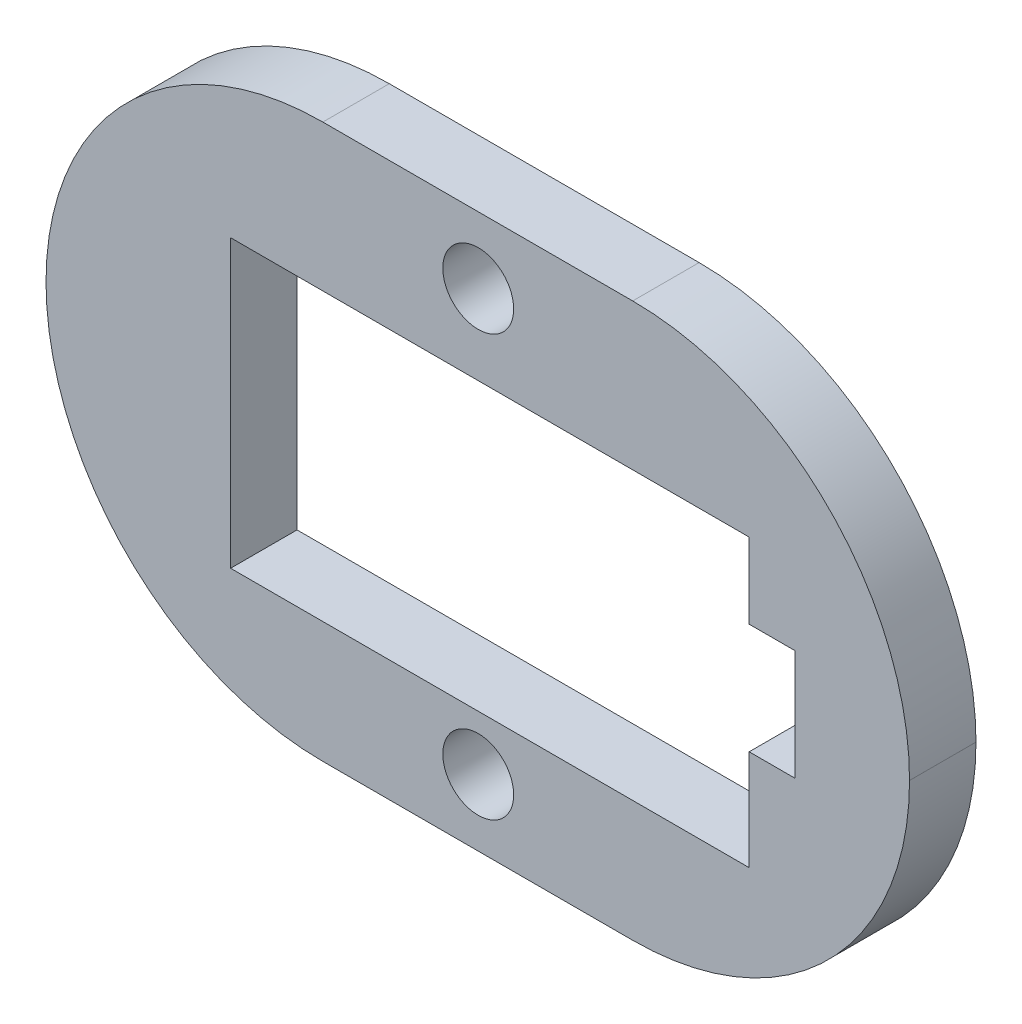
ISO-10303-21;
HEADER;
FILE_DESCRIPTION(('STEP AP214'),'2;1');
FILE_NAME('part.step','',(''),(''),'','','');
FILE_SCHEMA(('AUTOMOTIVE_DESIGN { 1 0 10303 214 1 1 1 1 }'));
ENDSEC;
DATA;
#1=APPLICATION_CONTEXT('core data for automotive mechanical design processes');
#2=APPLICATION_PROTOCOL_DEFINITION('international standard','automotive_design',2000,#1);
#3=PRODUCT_CONTEXT('',#1,'mechanical');
#4=PRODUCT('Part','Part','',(#3));
#5=PRODUCT_RELATED_PRODUCT_CATEGORY('part','',(#4));
#6=PRODUCT_DEFINITION_FORMATION('','',#4);
#7=PRODUCT_DEFINITION_CONTEXT('part definition',#1,'design');
#8=PRODUCT_DEFINITION('design','',#6,#7);
#9=PRODUCT_DEFINITION_SHAPE('','',#8);
#10=(LENGTH_UNIT() NAMED_UNIT(*) SI_UNIT(.MILLI.,.METRE.));
#11=(NAMED_UNIT(*) PLANE_ANGLE_UNIT() SI_UNIT($,.RADIAN.));
#12=(NAMED_UNIT(*) SI_UNIT($,.STERADIAN.) SOLID_ANGLE_UNIT());
#13=UNCERTAINTY_MEASURE_WITH_UNIT(LENGTH_MEASURE(1.E-05),#10,'distance_accuracy_value','');
#14=(GEOMETRIC_REPRESENTATION_CONTEXT(3) GLOBAL_UNCERTAINTY_ASSIGNED_CONTEXT((#13)) GLOBAL_UNIT_ASSIGNED_CONTEXT((#10,
#11,#12)) REPRESENTATION_CONTEXT('',''));
#15=CARTESIAN_POINT('',(0.,0.,0.));
#16=DIRECTION('',(0.,0.,1.));
#17=DIRECTION('',(1.,0.,0.));
#18=AXIS2_PLACEMENT_3D('',#15,#16,#17);
#19=CARTESIAN_POINT('',(-8.50332149258777,12.5,3.));
#20=DIRECTION('',(0.,0.,-1.));
#21=DIRECTION('',(-1.,0.,0.));
#22=AXIS2_PLACEMENT_3D('',#19,#20,#21);
#23=CYLINDRICAL_SURFACE('',#22,12.5);
#24=CARTESIAN_POINT('',(-8.50332149258777,12.5,0.));
#25=DIRECTION('',(0.,0.,-1.));
#26=DIRECTION('',(-1.,0.,0.));
#27=AXIS2_PLACEMENT_3D('',#24,#25,#26);
#28=CIRCLE('',#27,12.5);
#29=CARTESIAN_POINT('',(-8.50332149258777,0.,0.));
#30=VERTEX_POINT('',#29);
#31=CARTESIAN_POINT('',(-21.0033214925878,12.5,0.));
#32=VERTEX_POINT('',#31);
#33=EDGE_CURVE('E210',#30,#32,#28,.T.);
#34=ORIENTED_EDGE('',*,*,#33,.F.);
#35=DIRECTION('',(0.,0.,-1.));
#36=VECTOR('',#35,1.);
#37=CARTESIAN_POINT('',(-8.50332149258777,0.,3.));
#38=LINE('',#37,#36);
#39=CARTESIAN_POINT('',(-8.50332149258777,0.,3.));
#40=VERTEX_POINT('',#39);
#41=EDGE_CURVE('E264',#40,#30,#38,.T.);
#42=ORIENTED_EDGE('',*,*,#41,.F.);
#43=CARTESIAN_POINT('',(-8.50332149258777,12.5,3.));
#44=DIRECTION('',(0.,0.,-1.));
#45=DIRECTION('',(-1.,0.,0.));
#46=AXIS2_PLACEMENT_3D('',#43,#44,#45);
#47=CIRCLE('',#46,12.5);
#48=CARTESIAN_POINT('',(-21.0033214925878,12.5,3.));
#49=VERTEX_POINT('',#48);
#50=EDGE_CURVE('E222',#40,#49,#47,.T.);
#51=ORIENTED_EDGE('',*,*,#50,.T.);
#52=DIRECTION('',(0.,0.,-1.));
#53=VECTOR('',#52,1.);
#54=CARTESIAN_POINT('',(-21.0033214925878,12.5,3.));
#55=LINE('',#54,#53);
#56=EDGE_CURVE('E244',#49,#32,#55,.T.);
#57=ORIENTED_EDGE('',*,*,#56,.T.);
#58=EDGE_LOOP('',(#34,#42,#51,#57));
#59=FACE_BOUND('',#58,.T.);
#60=ADVANCED_FACE('F41',(#59),#23,.T.);
#61=CARTESIAN_POINT('',(5.48658919269266,0.,3.));
#62=DIRECTION('',(0.,-1.,0.));
#63=DIRECTION('',(0.,0.,-1.));
#64=AXIS2_PLACEMENT_3D('',#61,#62,#63);
#65=PLANE('',#64);
#66=DIRECTION('',(-1.,0.,0.));
#67=VECTOR('',#66,1.);
#68=CARTESIAN_POINT('',(5.48658919269266,0.,0.));
#69=LINE('',#68,#67);
#70=CARTESIAN_POINT('',(5.48658919269266,0.,0.));
#71=VERTEX_POINT('',#70);
#72=EDGE_CURVE('E226',#71,#30,#69,.T.);
#73=ORIENTED_EDGE('',*,*,#72,.F.);
#74=DIRECTION('',(0.,0.,-1.));
#75=VECTOR('',#74,1.);
#76=CARTESIAN_POINT('',(5.48658919269266,0.,3.));
#77=LINE('',#76,#75);
#78=CARTESIAN_POINT('',(5.48658919269266,0.,3.));
#79=VERTEX_POINT('',#78);
#80=EDGE_CURVE('E267',#79,#71,#77,.T.);
#81=ORIENTED_EDGE('',*,*,#80,.F.);
#82=DIRECTION('',(-1.,0.,0.));
#83=VECTOR('',#82,1.);
#84=CARTESIAN_POINT('',(5.48658919269266,0.,3.));
#85=LINE('',#84,#83);
#86=EDGE_CURVE('E241',#79,#40,#85,.T.);
#87=ORIENTED_EDGE('',*,*,#86,.T.);
#88=ORIENTED_EDGE('',*,*,#41,.T.);
#89=EDGE_LOOP('',(#73,#81,#87,#88));
#90=FACE_BOUND('',#89,.T.);
#91=ADVANCED_FACE('F327',(#90),#65,.T.);
#92=CARTESIAN_POINT('',(5.48658919269266,12.5,3.));
#93=DIRECTION('',(0.,0.,-1.));
#94=DIRECTION('',(-1.,0.,0.));
#95=AXIS2_PLACEMENT_3D('',#92,#93,#94);
#96=CYLINDRICAL_SURFACE('',#95,12.5);
#97=CARTESIAN_POINT('',(5.48658919269266,12.5,0.));
#98=DIRECTION('',(0.,0.,-1.));
#99=DIRECTION('',(-1.,0.,0.));
#100=AXIS2_PLACEMENT_3D('',#97,#98,#99);
#101=CIRCLE('',#100,12.5);
#102=CARTESIAN_POINT('',(17.9865891926927,12.5,0.));
#103=VERTEX_POINT('',#102);
#104=EDGE_CURVE('E259',#103,#71,#101,.T.);
#105=ORIENTED_EDGE('',*,*,#104,.F.);
#106=DIRECTION('',(0.,0.,-1.));
#107=VECTOR('',#106,1.);
#108=CARTESIAN_POINT('',(17.9865891926927,12.5,3.));
#109=LINE('',#108,#107);
#110=CARTESIAN_POINT('',(17.9865891926927,12.5,3.));
#111=VERTEX_POINT('',#110);
#112=EDGE_CURVE('E269',#111,#103,#109,.T.);
#113=ORIENTED_EDGE('',*,*,#112,.F.);
#114=CARTESIAN_POINT('',(5.48658919269266,12.5,3.));
#115=DIRECTION('',(0.,0.,-1.));
#116=DIRECTION('',(-1.,0.,0.));
#117=AXIS2_PLACEMENT_3D('',#114,#115,#116);
#118=CIRCLE('',#117,12.5);
#119=EDGE_CURVE('E238',#111,#79,#118,.T.);
#120=ORIENTED_EDGE('',*,*,#119,.T.);
#121=ORIENTED_EDGE('',*,*,#80,.T.);
#122=EDGE_LOOP('',(#105,#113,#120,#121));
#123=FACE_BOUND('',#122,.T.);
#124=ADVANCED_FACE('F325',(#123),#96,.T.);
#125=CARTESIAN_POINT('',(17.9865891926927,12.501,3.));
#126=DIRECTION('',(1.,0.,0.));
#127=DIRECTION('',(0.,0.,-1.));
#128=AXIS2_PLACEMENT_3D('',#125,#126,#127);
#129=PLANE('',#128);
#130=DIRECTION('',(0.,-1.,0.));
#131=VECTOR('',#130,1.);
#132=CARTESIAN_POINT('',(17.9865891926927,12.501,0.));
#133=LINE('',#132,#131);
#134=CARTESIAN_POINT('',(17.9865891926927,12.501,0.));
#135=VERTEX_POINT('',#134);
#136=EDGE_CURVE('E256',#135,#103,#133,.T.);
#137=ORIENTED_EDGE('',*,*,#136,.F.);
#138=DIRECTION('',(0.,0.,-1.));
#139=VECTOR('',#138,1.);
#140=CARTESIAN_POINT('',(17.9865891926927,12.501,3.));
#141=LINE('',#140,#139);
#142=CARTESIAN_POINT('',(17.9865891926927,12.501,3.));
#143=VERTEX_POINT('',#142);
#144=EDGE_CURVE('E271',#143,#135,#141,.T.);
#145=ORIENTED_EDGE('',*,*,#144,.F.);
#146=DIRECTION('',(0.,-1.,0.));
#147=VECTOR('',#146,1.);
#148=CARTESIAN_POINT('',(17.9865891926927,12.501,3.));
#149=LINE('',#148,#147);
#150=EDGE_CURVE('E235',#143,#111,#149,.T.);
#151=ORIENTED_EDGE('',*,*,#150,.T.);
#152=ORIENTED_EDGE('',*,*,#112,.T.);
#153=EDGE_LOOP('',(#137,#145,#151,#152));
#154=FACE_BOUND('',#153,.T.);
#155=ADVANCED_FACE('F321',(#154),#129,.T.);
#156=CARTESIAN_POINT('',(5.48658919269266,12.501,3.));
#157=DIRECTION('',(0.,0.,-1.));
#158=DIRECTION('',(-1.,0.,0.));
#159=AXIS2_PLACEMENT_3D('',#156,#157,#158);
#160=CYLINDRICAL_SURFACE('',#159,12.5);
#161=CARTESIAN_POINT('',(5.48658919269266,12.501,0.));
#162=DIRECTION('',(0.,0.,-1.));
#163=DIRECTION('',(-1.,0.,0.));
#164=AXIS2_PLACEMENT_3D('',#161,#162,#163);
#165=CIRCLE('',#164,12.5);
#166=CARTESIAN_POINT('',(5.48658919269266,25.001,0.));
#167=VERTEX_POINT('',#166);
#168=EDGE_CURVE('E253',#167,#135,#165,.T.);
#169=ORIENTED_EDGE('',*,*,#168,.F.);
#170=DIRECTION('',(0.,0.,-1.));
#171=VECTOR('',#170,1.);
#172=CARTESIAN_POINT('',(5.48658919269266,25.001,3.));
#173=LINE('',#172,#171);
#174=CARTESIAN_POINT('',(5.48658919269266,25.001,3.));
#175=VERTEX_POINT('',#174);
#176=EDGE_CURVE('E273',#175,#167,#173,.T.);
#177=ORIENTED_EDGE('',*,*,#176,.F.);
#178=CARTESIAN_POINT('',(5.48658919269266,12.501,3.));
#179=DIRECTION('',(0.,0.,-1.));
#180=DIRECTION('',(-1.,0.,0.));
#181=AXIS2_PLACEMENT_3D('',#178,#179,#180);
#182=CIRCLE('',#181,12.5);
#183=EDGE_CURVE('E232',#175,#143,#182,.T.);
#184=ORIENTED_EDGE('',*,*,#183,.T.);
#185=ORIENTED_EDGE('',*,*,#144,.T.);
#186=EDGE_LOOP('',(#169,#177,#184,#185));
#187=FACE_BOUND('',#186,.T.);
#188=ADVANCED_FACE('F317',(#187),#160,.T.);
#189=CARTESIAN_POINT('',(-8.50332151258617,25.001,3.));
#190=DIRECTION('',(0.,1.,0.));
#191=DIRECTION('',(-1.,0.,0.));
#192=AXIS2_PLACEMENT_3D('',#189,#190,#191);
#193=PLANE('',#192);
#194=DIRECTION('',(1.,0.,0.));
#195=VECTOR('',#194,1.);
#196=CARTESIAN_POINT('',(-8.50332151258617,25.001,0.));
#197=LINE('',#196,#195);
#198=CARTESIAN_POINT('',(-8.50332151258617,25.001,0.));
#199=VERTEX_POINT('',#198);
#200=EDGE_CURVE('E250',#199,#167,#197,.T.);
#201=ORIENTED_EDGE('',*,*,#200,.F.);
#202=DIRECTION('',(0.,0.,-1.));
#203=VECTOR('',#202,1.);
#204=CARTESIAN_POINT('',(-8.50332151258617,25.001,3.));
#205=LINE('',#204,#203);
#206=CARTESIAN_POINT('',(-8.50332151258617,25.001,3.));
#207=VERTEX_POINT('',#206);
#208=EDGE_CURVE('E275',#207,#199,#205,.T.);
#209=ORIENTED_EDGE('',*,*,#208,.F.);
#210=DIRECTION('',(1.,0.,0.));
#211=VECTOR('',#210,1.);
#212=CARTESIAN_POINT('',(-8.50332151258617,25.001,3.));
#213=LINE('',#212,#211);
#214=EDGE_CURVE('E229',#207,#175,#213,.T.);
#215=ORIENTED_EDGE('',*,*,#214,.T.);
#216=ORIENTED_EDGE('',*,*,#176,.T.);
#217=EDGE_LOOP('',(#201,#209,#215,#216));
#218=FACE_BOUND('',#217,.T.);
#219=ADVANCED_FACE('F313',(#218),#193,.T.);
#220=CARTESIAN_POINT('',(-8.50332151258617,12.50099998,3.));
#221=DIRECTION('',(0.,0.,-1.));
#222=DIRECTION('',(-1.,0.,0.));
#223=AXIS2_PLACEMENT_3D('',#220,#221,#222);
#224=CYLINDRICAL_SURFACE('',#223,12.50000002);
#225=CARTESIAN_POINT('',(-8.50332151258617,12.50099998,0.));
#226=DIRECTION('',(0.,0.,-1.));
#227=DIRECTION('',(-1.,0.,0.));
#228=AXIS2_PLACEMENT_3D('',#225,#226,#227);
#229=CIRCLE('',#228,12.50000002);
#230=EDGE_CURVE('E247',#32,#199,#229,.T.);
#231=ORIENTED_EDGE('',*,*,#230,.F.);
#232=ORIENTED_EDGE('',*,*,#56,.F.);
#233=CARTESIAN_POINT('',(-8.50332151258617,12.50099998,3.));
#234=DIRECTION('',(0.,0.,-1.));
#235=DIRECTION('',(-1.,0.,0.));
#236=AXIS2_PLACEMENT_3D('',#233,#234,#235);
#237=CIRCLE('',#236,12.50000002);
#238=EDGE_CURVE('E225',#49,#207,#237,.T.);
#239=ORIENTED_EDGE('',*,*,#238,.T.);
#240=ORIENTED_EDGE('',*,*,#208,.T.);
#241=EDGE_LOOP('',(#231,#232,#239,#240));
#242=FACE_BOUND('',#241,.T.);
#243=ADVANCED_FACE('F309',(#242),#224,.T.);
#244=CARTESIAN_POINT('',(-8.50332149258777,12.5,3.));
#245=DIRECTION('',(0.,0.,-1.));
#246=DIRECTION('',(-1.,0.,0.));
#247=AXIS2_PLACEMENT_3D('',#244,#245,#246);
#248=PLANE('',#247);
#249=CARTESIAN_POINT('',(-1.48790597129112,21.9995,3.));
#250=DIRECTION('',(0.,0.,1.));
#251=DIRECTION('',(1.,0.,0.));
#252=AXIS2_PLACEMENT_3D('',#249,#250,#251);
#253=CIRCLE('',#252,1.6);
#254=CARTESIAN_POINT('',(0.11209402870888,21.9995,3.));
#255=VERTEX_POINT('',#254);
#256=EDGE_CURVE('E192',#255,#255,#253,.T.);
#257=ORIENTED_EDGE('',*,*,#256,.F.);
#258=EDGE_LOOP('',(#257));
#259=FACE_BOUND('',#258,.T.);
#260=CARTESIAN_POINT('',(-1.48790597129112,2.9995,3.));
#261=DIRECTION('',(0.,0.,1.));
#262=DIRECTION('',(1.,0.,0.));
#263=AXIS2_PLACEMENT_3D('',#260,#261,#262);
#264=CIRCLE('',#263,1.6);
#265=CARTESIAN_POINT('',(0.11209402870888,2.9995,3.));
#266=VERTEX_POINT('',#265);
#267=EDGE_CURVE('E174',#266,#266,#264,.T.);
#268=ORIENTED_EDGE('',*,*,#267,.F.);
#269=EDGE_LOOP('',(#268));
#270=FACE_BOUND('',#269,.T.);
#271=DIRECTION('',(1.,0.,0.));
#272=VECTOR('',#271,1.);
#273=CARTESIAN_POINT('',(12.8054141089037,14.9896847646827,3.));
#274=LINE('',#273,#272);
#275=CARTESIAN_POINT('',(10.7445904090118,14.9896847646827,3.));
#276=VERTEX_POINT('',#275);
#277=CARTESIAN_POINT('',(12.8054141089037,14.9896847646827,3.));
#278=VERTEX_POINT('',#277);
#279=EDGE_CURVE('E157',#276,#278,#274,.T.);
#280=ORIENTED_EDGE('',*,*,#279,.T.);
#281=DIRECTION('',(0.,-1.,0.));
#282=VECTOR('',#281,1.);
#283=CARTESIAN_POINT('',(12.8054141089037,10.001,3.));
#284=LINE('',#283,#282);
#285=CARTESIAN_POINT('',(12.8054141089037,10.001,3.));
#286=VERTEX_POINT('',#285);
#287=EDGE_CURVE('E151',#278,#286,#284,.T.);
#288=ORIENTED_EDGE('',*,*,#287,.T.);
#289=DIRECTION('',(-1.,0.,0.));
#290=VECTOR('',#289,1.);
#291=CARTESIAN_POINT('',(10.7445904090118,10.001,3.));
#292=LINE('',#291,#290);
#293=CARTESIAN_POINT('',(10.7445904090118,10.001,3.));
#294=VERTEX_POINT('',#293);
#295=EDGE_CURVE('E160',#286,#294,#292,.T.);
#296=ORIENTED_EDGE('',*,*,#295,.T.);
#297=DIRECTION('',(0.,-1.,0.));
#298=VECTOR('',#297,1.);
#299=CARTESIAN_POINT('',(10.7445904090118,5.47023212857004,3.));
#300=LINE('',#299,#298);
#301=CARTESIAN_POINT('',(10.7445904090118,5.47023212857004,3.));
#302=VERTEX_POINT('',#301);
#303=EDGE_CURVE('E57',#294,#302,#300,.T.);
#304=ORIENTED_EDGE('',*,*,#303,.T.);
#305=DIRECTION('',(-1.,0.,0.));
#306=VECTOR('',#305,1.);
#307=CARTESIAN_POINT('',(-12.6687342064032,5.47023212857004,3.));
#308=LINE('',#307,#306);
#309=CARTESIAN_POINT('',(-12.6687342064032,5.47023212857004,3.));
#310=VERTEX_POINT('',#309);
#311=EDGE_CURVE('E178',#302,#310,#308,.T.);
#312=ORIENTED_EDGE('',*,*,#311,.T.);
#313=DIRECTION('',(0.,1.,0.));
#314=VECTOR('',#313,1.);
#315=CARTESIAN_POINT('',(-12.6687342064032,18.3961064057703,3.));
#316=LINE('',#315,#314);
#317=CARTESIAN_POINT('',(-12.6687342064032,18.3961064057703,3.));
#318=VERTEX_POINT('',#317);
#319=EDGE_CURVE('E181',#310,#318,#316,.T.);
#320=ORIENTED_EDGE('',*,*,#319,.T.);
#321=DIRECTION('',(1.,0.,0.));
#322=VECTOR('',#321,1.);
#323=CARTESIAN_POINT('',(10.7445904090118,18.3961064057703,3.));
#324=LINE('',#323,#322);
#325=CARTESIAN_POINT('',(10.7445904090118,18.3961064057703,3.));
#326=VERTEX_POINT('',#325);
#327=EDGE_CURVE('E184',#318,#326,#324,.T.);
#328=ORIENTED_EDGE('',*,*,#327,.T.);
#329=DIRECTION('',(0.,-1.,0.));
#330=VECTOR('',#329,1.);
#331=CARTESIAN_POINT('',(10.7445904090118,14.9896847646827,3.));
#332=LINE('',#331,#330);
#333=EDGE_CURVE('E187',#326,#276,#332,.T.);
#334=ORIENTED_EDGE('',*,*,#333,.T.);
#335=EDGE_LOOP('',(#280,#288,#296,#304,#312,#320,#328,#334));
#336=FACE_BOUND('',#335,.T.);
#337=ORIENTED_EDGE('',*,*,#50,.F.);
#338=ORIENTED_EDGE('',*,*,#86,.F.);
#339=ORIENTED_EDGE('',*,*,#119,.F.);
#340=ORIENTED_EDGE('',*,*,#150,.F.);
#341=ORIENTED_EDGE('',*,*,#183,.F.);
#342=ORIENTED_EDGE('',*,*,#214,.F.);
#343=ORIENTED_EDGE('',*,*,#238,.F.);
#344=EDGE_LOOP('',(#337,#338,#339,#340,#341,#342,#343));
#345=FACE_BOUND('',#344,.T.);
#346=ADVANCED_FACE('F164',(#259,#270,#336,#345),#248,.F.);
#347=CARTESIAN_POINT('',(-8.50332149258777,12.5,0.));
#348=DIRECTION('',(0.,0.,-1.));
#349=DIRECTION('',(-1.,0.,0.));
#350=AXIS2_PLACEMENT_3D('',#347,#348,#349);
#351=PLANE('',#350);
#352=CARTESIAN_POINT('',(-1.48790597129112,2.9995,0.));
#353=DIRECTION('',(0.,0.,-1.));
#354=DIRECTION('',(-1.,0.,0.));
#355=AXIS2_PLACEMENT_3D('',#352,#353,#354);
#356=CIRCLE('',#355,1.9);
#357=CARTESIAN_POINT('',(-3.38790597129112,2.9995,0.));
#358=VERTEX_POINT('',#357);
#359=EDGE_CURVE('E280',#358,#358,#356,.F.);
#360=ORIENTED_EDGE('',*,*,#359,.T.);
#361=EDGE_LOOP('',(#360));
#362=FACE_BOUND('',#361,.T.);
#363=CARTESIAN_POINT('',(-1.48790597129112,21.9995,0.));
#364=DIRECTION('',(0.,0.,-1.));
#365=DIRECTION('',(-1.,0.,0.));
#366=AXIS2_PLACEMENT_3D('',#363,#364,#365);
#367=CIRCLE('',#366,1.9);
#368=CARTESIAN_POINT('',(-3.38790597129112,21.9995,0.));
#369=VERTEX_POINT('',#368);
#370=EDGE_CURVE('E266',#369,#369,#367,.F.);
#371=ORIENTED_EDGE('',*,*,#370,.T.);
#372=EDGE_LOOP('',(#371));
#373=FACE_BOUND('',#372,.T.);
#374=DIRECTION('',(0.,-1.,0.));
#375=VECTOR('',#374,1.);
#376=CARTESIAN_POINT('',(12.8054141089037,10.001,0.));
#377=LINE('',#376,#375);
#378=CARTESIAN_POINT('',(12.8054141089037,14.9896847646827,0.));
#379=VERTEX_POINT('',#378);
#380=CARTESIAN_POINT('',(12.8054141089037,10.001,0.));
#381=VERTEX_POINT('',#380);
#382=EDGE_CURVE('E65',#379,#381,#377,.T.);
#383=ORIENTED_EDGE('',*,*,#382,.F.);
#384=DIRECTION('',(1.,0.,0.));
#385=VECTOR('',#384,1.);
#386=CARTESIAN_POINT('',(12.8054141089037,14.9896847646827,0.));
#387=LINE('',#386,#385);
#388=CARTESIAN_POINT('',(10.7445904090118,14.9896847646827,0.));
#389=VERTEX_POINT('',#388);
#390=EDGE_CURVE('E168',#389,#379,#387,.T.);
#391=ORIENTED_EDGE('',*,*,#390,.F.);
#392=DIRECTION('',(0.,-1.,0.));
#393=VECTOR('',#392,1.);
#394=CARTESIAN_POINT('',(10.7445904090118,14.9896847646827,0.));
#395=LINE('',#394,#393);
#396=CARTESIAN_POINT('',(10.7445904090118,18.3961064057703,0.));
#397=VERTEX_POINT('',#396);
#398=EDGE_CURVE('E171',#397,#389,#395,.T.);
#399=ORIENTED_EDGE('',*,*,#398,.F.);
#400=DIRECTION('',(1.,0.,0.));
#401=VECTOR('',#400,1.);
#402=CARTESIAN_POINT('',(10.7445904090118,18.3961064057703,0.));
#403=LINE('',#402,#401);
#404=CARTESIAN_POINT('',(-12.6687342064032,18.3961064057703,0.));
#405=VERTEX_POINT('',#404);
#406=EDGE_CURVE('E203',#405,#397,#403,.T.);
#407=ORIENTED_EDGE('',*,*,#406,.F.);
#408=DIRECTION('',(0.,1.,0.));
#409=VECTOR('',#408,1.);
#410=CARTESIAN_POINT('',(-12.6687342064032,18.3961064057703,0.));
#411=LINE('',#410,#409);
#412=CARTESIAN_POINT('',(-12.6687342064032,5.47023212857004,0.));
#413=VERTEX_POINT('',#412);
#414=EDGE_CURVE('E200',#413,#405,#411,.T.);
#415=ORIENTED_EDGE('',*,*,#414,.F.);
#416=DIRECTION('',(-1.,0.,0.));
#417=VECTOR('',#416,1.);
#418=CARTESIAN_POINT('',(-12.6687342064032,5.47023212857004,0.));
#419=LINE('',#418,#417);
#420=CARTESIAN_POINT('',(10.7445904090118,5.47023212857004,0.));
#421=VERTEX_POINT('',#420);
#422=EDGE_CURVE('E197',#421,#413,#419,.T.);
#423=ORIENTED_EDGE('',*,*,#422,.F.);
#424=DIRECTION('',(0.,-1.,0.));
#425=VECTOR('',#424,1.);
#426=CARTESIAN_POINT('',(10.7445904090118,5.47023212857004,0.));
#427=LINE('',#426,#425);
#428=CARTESIAN_POINT('',(10.7445904090118,10.001,0.));
#429=VERTEX_POINT('',#428);
#430=EDGE_CURVE('E194',#429,#421,#427,.T.);
#431=ORIENTED_EDGE('',*,*,#430,.F.);
#432=DIRECTION('',(-1.,0.,0.));
#433=VECTOR('',#432,1.);
#434=CARTESIAN_POINT('',(10.7445904090118,10.001,0.));
#435=LINE('',#434,#433);
#436=EDGE_CURVE('E191',#381,#429,#435,.T.);
#437=ORIENTED_EDGE('',*,*,#436,.F.);
#438=EDGE_LOOP('',(#383,#391,#399,#407,#415,#423,#431,#437));
#439=FACE_BOUND('',#438,.T.);
#440=ORIENTED_EDGE('',*,*,#33,.T.);
#441=ORIENTED_EDGE('',*,*,#230,.T.);
#442=ORIENTED_EDGE('',*,*,#200,.T.);
#443=ORIENTED_EDGE('',*,*,#168,.T.);
#444=ORIENTED_EDGE('',*,*,#136,.T.);
#445=ORIENTED_EDGE('',*,*,#104,.T.);
#446=ORIENTED_EDGE('',*,*,#72,.T.);
#447=EDGE_LOOP('',(#440,#441,#442,#443,#444,#445,#446));
#448=FACE_BOUND('',#447,.T.);
#449=ADVANCED_FACE('F294',(#362,#373,#439,#448),#351,.T.);
#450=CARTESIAN_POINT('',(12.8054141089037,10.001,3.));
#451=DIRECTION('',(1.,0.,0.));
#452=DIRECTION('',(0.,0.,-1.));
#453=AXIS2_PLACEMENT_3D('',#450,#451,#452);
#454=PLANE('',#453);
#455=ORIENTED_EDGE('',*,*,#382,.T.);
#456=DIRECTION('',(0.,0.,-1.));
#457=VECTOR('',#456,1.);
#458=CARTESIAN_POINT('',(12.8054141089037,10.001,3.));
#459=LINE('',#458,#457);
#460=EDGE_CURVE('E147',#286,#381,#459,.T.);
#461=ORIENTED_EDGE('',*,*,#460,.F.);
#462=ORIENTED_EDGE('',*,*,#287,.F.);
#463=DIRECTION('',(0.,0.,-1.));
#464=VECTOR('',#463,1.);
#465=CARTESIAN_POINT('',(12.8054141089037,14.9896847646827,3.));
#466=LINE('',#465,#464);
#467=EDGE_CURVE('E208',#278,#379,#466,.T.);
#468=ORIENTED_EDGE('',*,*,#467,.T.);
#469=EDGE_LOOP('',(#455,#461,#462,#468));
#470=FACE_BOUND('',#469,.T.);
#471=ADVANCED_FACE('F149',(#470),#454,.F.);
#472=CARTESIAN_POINT('',(12.8054141089037,14.9896847646827,3.));
#473=DIRECTION('',(0.,1.,0.));
#474=DIRECTION('',(0.,0.,1.));
#475=AXIS2_PLACEMENT_3D('',#472,#473,#474);
#476=PLANE('',#475);
#477=ORIENTED_EDGE('',*,*,#390,.T.);
#478=ORIENTED_EDGE('',*,*,#467,.F.);
#479=ORIENTED_EDGE('',*,*,#279,.F.);
#480=DIRECTION('',(0.,0.,-1.));
#481=VECTOR('',#480,1.);
#482=CARTESIAN_POINT('',(10.7445904090118,14.9896847646827,3.));
#483=LINE('',#482,#481);
#484=EDGE_CURVE('E211',#276,#389,#483,.T.);
#485=ORIENTED_EDGE('',*,*,#484,.T.);
#486=EDGE_LOOP('',(#477,#478,#479,#485));
#487=FACE_BOUND('',#486,.T.);
#488=ADVANCED_FACE('F390',(#487),#476,.F.);
#489=CARTESIAN_POINT('',(10.7445904090118,14.9896847646827,3.));
#490=DIRECTION('',(1.,0.,0.));
#491=DIRECTION('',(0.,0.,-1.));
#492=AXIS2_PLACEMENT_3D('',#489,#490,#491);
#493=PLANE('',#492);
#494=ORIENTED_EDGE('',*,*,#398,.T.);
#495=ORIENTED_EDGE('',*,*,#484,.F.);
#496=ORIENTED_EDGE('',*,*,#333,.F.);
#497=DIRECTION('',(0.,0.,-1.));
#498=VECTOR('',#497,1.);
#499=CARTESIAN_POINT('',(10.7445904090118,18.3961064057703,3.));
#500=LINE('',#499,#498);
#501=EDGE_CURVE('E213',#326,#397,#500,.T.);
#502=ORIENTED_EDGE('',*,*,#501,.T.);
#503=EDGE_LOOP('',(#494,#495,#496,#502));
#504=FACE_BOUND('',#503,.T.);
#505=ADVANCED_FACE('F398',(#504),#493,.F.);
#506=CARTESIAN_POINT('',(10.7445904090118,18.3961064057703,3.));
#507=DIRECTION('',(0.,1.,0.));
#508=DIRECTION('',(0.,0.,1.));
#509=AXIS2_PLACEMENT_3D('',#506,#507,#508);
#510=PLANE('',#509);
#511=ORIENTED_EDGE('',*,*,#406,.T.);
#512=ORIENTED_EDGE('',*,*,#501,.F.);
#513=ORIENTED_EDGE('',*,*,#327,.F.);
#514=DIRECTION('',(0.,0.,-1.));
#515=VECTOR('',#514,1.);
#516=CARTESIAN_POINT('',(-12.6687342064032,18.3961064057703,3.));
#517=LINE('',#516,#515);
#518=EDGE_CURVE('E215',#318,#405,#517,.T.);
#519=ORIENTED_EDGE('',*,*,#518,.T.);
#520=EDGE_LOOP('',(#511,#512,#513,#519));
#521=FACE_BOUND('',#520,.T.);
#522=ADVANCED_FACE('F407',(#521),#510,.F.);
#523=CARTESIAN_POINT('',(-12.6687342064032,18.3961064057703,3.));
#524=DIRECTION('',(-1.,0.,0.));
#525=DIRECTION('',(0.,0.,1.));
#526=AXIS2_PLACEMENT_3D('',#523,#524,#525);
#527=PLANE('',#526);
#528=ORIENTED_EDGE('',*,*,#414,.T.);
#529=ORIENTED_EDGE('',*,*,#518,.F.);
#530=ORIENTED_EDGE('',*,*,#319,.F.);
#531=DIRECTION('',(0.,0.,-1.));
#532=VECTOR('',#531,1.);
#533=CARTESIAN_POINT('',(-12.6687342064032,5.47023212857004,3.));
#534=LINE('',#533,#532);
#535=EDGE_CURVE('E217',#310,#413,#534,.T.);
#536=ORIENTED_EDGE('',*,*,#535,.T.);
#537=EDGE_LOOP('',(#528,#529,#530,#536));
#538=FACE_BOUND('',#537,.T.);
#539=ADVANCED_FACE('F416',(#538),#527,.F.);
#540=CARTESIAN_POINT('',(-12.6687342064032,5.47023212857004,3.));
#541=DIRECTION('',(0.,-1.,0.));
#542=DIRECTION('',(1.,0.,0.));
#543=AXIS2_PLACEMENT_3D('',#540,#541,#542);
#544=PLANE('',#543);
#545=ORIENTED_EDGE('',*,*,#422,.T.);
#546=ORIENTED_EDGE('',*,*,#535,.F.);
#547=ORIENTED_EDGE('',*,*,#311,.F.);
#548=DIRECTION('',(0.,0.,-1.));
#549=VECTOR('',#548,1.);
#550=CARTESIAN_POINT('',(10.7445904090118,5.47023212857004,3.));
#551=LINE('',#550,#549);
#552=EDGE_CURVE('E219',#302,#421,#551,.T.);
#553=ORIENTED_EDGE('',*,*,#552,.T.);
#554=EDGE_LOOP('',(#545,#546,#547,#553));
#555=FACE_BOUND('',#554,.T.);
#556=ADVANCED_FACE('F425',(#555),#544,.F.);
#557=CARTESIAN_POINT('',(10.7445904090118,5.47023212857004,3.));
#558=DIRECTION('',(1.,0.,0.));
#559=DIRECTION('',(0.,0.,-1.));
#560=AXIS2_PLACEMENT_3D('',#557,#558,#559);
#561=PLANE('',#560);
#562=ORIENTED_EDGE('',*,*,#430,.T.);
#563=ORIENTED_EDGE('',*,*,#552,.F.);
#564=ORIENTED_EDGE('',*,*,#303,.F.);
#565=DIRECTION('',(0.,0.,-1.));
#566=VECTOR('',#565,1.);
#567=CARTESIAN_POINT('',(10.7445904090118,10.001,3.));
#568=LINE('',#567,#566);
#569=EDGE_CURVE('E156',#294,#429,#568,.T.);
#570=ORIENTED_EDGE('',*,*,#569,.T.);
#571=EDGE_LOOP('',(#562,#563,#564,#570));
#572=FACE_BOUND('',#571,.T.);
#573=ADVANCED_FACE('F434',(#572),#561,.F.);
#574=CARTESIAN_POINT('',(10.7445904090118,10.001,3.));
#575=DIRECTION('',(0.,-1.,0.));
#576=DIRECTION('',(0.,0.,-1.));
#577=AXIS2_PLACEMENT_3D('',#574,#575,#576);
#578=PLANE('',#577);
#579=ORIENTED_EDGE('',*,*,#436,.T.);
#580=ORIENTED_EDGE('',*,*,#569,.F.);
#581=ORIENTED_EDGE('',*,*,#295,.F.);
#582=ORIENTED_EDGE('',*,*,#460,.T.);
#583=EDGE_LOOP('',(#579,#580,#581,#582));
#584=FACE_BOUND('',#583,.T.);
#585=ADVANCED_FACE('F161',(#584),#578,.F.);
#586=CARTESIAN_POINT('',(-1.48790597129112,2.9995,0.));
#587=DIRECTION('',(0.,0.,1.));
#588=DIRECTION('',(1.,0.,0.));
#589=AXIS2_PLACEMENT_3D('',#586,#587,#588);
#590=CYLINDRICAL_SURFACE('',#589,1.6);
#591=CARTESIAN_POINT('',(-1.48790597129112,2.9995,0.299999999999999));
#592=DIRECTION('',(0.,0.,-1.));
#593=DIRECTION('',(-1.,0.,0.));
#594=AXIS2_PLACEMENT_3D('',#591,#592,#593);
#595=CIRCLE('',#594,1.6);
#596=CARTESIAN_POINT('',(-3.08790597129112,2.9995,0.299999999999999));
#597=VERTEX_POINT('',#596);
#598=EDGE_CURVE('E50',#597,#597,#595,.T.);
#599=ORIENTED_EDGE('',*,*,#598,.T.);
#600=EDGE_LOOP('',(#599));
#601=FACE_BOUND('',#600,.T.);
#602=ORIENTED_EDGE('',*,*,#267,.T.);
#603=EDGE_LOOP('',(#602));
#604=FACE_BOUND('',#603,.T.);
#605=ADVANCED_FACE('F285',(#601,#604),#590,.F.);
#606=CARTESIAN_POINT('',(-1.48790597129112,21.9995,0.));
#607=DIRECTION('',(0.,0.,1.));
#608=DIRECTION('',(1.,0.,0.));
#609=AXIS2_PLACEMENT_3D('',#606,#607,#608);
#610=CYLINDRICAL_SURFACE('',#609,1.6);
#611=CARTESIAN_POINT('',(-1.48790597129112,21.9995,0.299999999999998));
#612=DIRECTION('',(0.,0.,-1.));
#613=DIRECTION('',(-1.,0.,0.));
#614=AXIS2_PLACEMENT_3D('',#611,#612,#613);
#615=CIRCLE('',#614,1.6);
#616=CARTESIAN_POINT('',(-3.08790597129112,21.9995,0.299999999999998));
#617=VERTEX_POINT('',#616);
#618=EDGE_CURVE('E11',#617,#617,#615,.T.);
#619=ORIENTED_EDGE('',*,*,#618,.T.);
#620=EDGE_LOOP('',(#619));
#621=FACE_BOUND('',#620,.T.);
#622=ORIENTED_EDGE('',*,*,#256,.T.);
#623=EDGE_LOOP('',(#622));
#624=FACE_BOUND('',#623,.T.);
#625=ADVANCED_FACE('F291',(#621,#624),#610,.F.);
#626=CARTESIAN_POINT('',(-1.48790597129112,2.9995,0.));
#627=DIRECTION('',(0.,0.,-1.));
#628=DIRECTION('',(-1.,0.,0.));
#629=AXIS2_PLACEMENT_3D('',#626,#627,#628);
#630=CONICAL_SURFACE('',#629,1.9,0.785398163397443);
#631=CARTESIAN_POINT('',(-3.08790597129112,2.9995,0.299999999999999));
#632=CARTESIAN_POINT('',(-3.09103097129112,2.9995,0.296874999999999));
#633=CARTESIAN_POINT('',(-3.09415597129112,2.9995,0.293749999999999));
#634=CARTESIAN_POINT('',(-3.10040597129112,2.9995,0.287499999999999));
#635=CARTESIAN_POINT('',(-3.10353097129112,2.9995,0.284374999999999));
#636=CARTESIAN_POINT('',(-3.10978097129112,2.9995,0.278124999999999));
#637=CARTESIAN_POINT('',(-3.11290597129112,2.9995,0.274999999999999));
#638=CARTESIAN_POINT('',(-3.11915597129112,2.9995,0.268749999999999));
#639=CARTESIAN_POINT('',(-3.12228097129112,2.9995,0.265624999999999));
#640=CARTESIAN_POINT('',(-3.12853097129112,2.9995,0.259374999999999));
#641=CARTESIAN_POINT('',(-3.13165597129112,2.9995,0.256249999999999));
#642=CARTESIAN_POINT('',(-3.13790597129112,2.9995,0.249999999999999));
#643=CARTESIAN_POINT('',(-3.14103097129112,2.9995,0.246874999999999));
#644=CARTESIAN_POINT('',(-3.14728097129112,2.9995,0.240624999999999));
#645=CARTESIAN_POINT('',(-3.15040597129112,2.9995,0.237499999999999));
#646=CARTESIAN_POINT('',(-3.15665597129112,2.9995,0.231249999999999));
#647=CARTESIAN_POINT('',(-3.15978097129112,2.9995,0.228124999999999));
#648=CARTESIAN_POINT('',(-3.16603097129112,2.9995,0.221874999999999));
#649=CARTESIAN_POINT('',(-3.16915597129112,2.9995,0.218749999999999));
#650=CARTESIAN_POINT('',(-3.17540597129112,2.9995,0.212499999999999));
#651=CARTESIAN_POINT('',(-3.17853097129112,2.9995,0.209374999999999));
#652=CARTESIAN_POINT('',(-3.18478097129112,2.9995,0.203124999999999));
#653=CARTESIAN_POINT('',(-3.18790597129112,2.9995,0.199999999999999));
#654=CARTESIAN_POINT('',(-3.19415597129112,2.9995,0.193749999999999));
#655=CARTESIAN_POINT('',(-3.19728097129112,2.9995,0.190624999999999));
#656=CARTESIAN_POINT('',(-3.20353097129112,2.9995,0.184374999999999));
#657=CARTESIAN_POINT('',(-3.20665597129112,2.9995,0.181249999999999));
#658=CARTESIAN_POINT('',(-3.21290597129112,2.9995,0.174999999999999));
#659=CARTESIAN_POINT('',(-3.21603097129112,2.9995,0.171874999999999));
#660=CARTESIAN_POINT('',(-3.22228097129112,2.9995,0.165624999999999));
#661=CARTESIAN_POINT('',(-3.22540597129112,2.9995,0.162499999999999));
#662=CARTESIAN_POINT('',(-3.23165597129112,2.9995,0.156249999999999));
#663=CARTESIAN_POINT('',(-3.23478097129112,2.9995,0.153124999999999));
#664=CARTESIAN_POINT('',(-3.24103097129112,2.9995,0.146874999999999));
#665=CARTESIAN_POINT('',(-3.24415597129112,2.9995,0.143749999999999));
#666=CARTESIAN_POINT('',(-3.25040597129112,2.9995,0.137499999999999));
#667=CARTESIAN_POINT('',(-3.25353097129112,2.9995,0.134374999999999));
#668=CARTESIAN_POINT('',(-3.25978097129112,2.9995,0.128124999999999));
#669=CARTESIAN_POINT('',(-3.26290597129112,2.9995,0.124999999999999));
#670=CARTESIAN_POINT('',(-3.26915597129112,2.9995,0.118749999999999));
#671=CARTESIAN_POINT('',(-3.27228097129112,2.9995,0.115625));
#672=CARTESIAN_POINT('',(-3.27853097129112,2.9995,0.109375));
#673=CARTESIAN_POINT('',(-3.28165597129112,2.9995,0.10625));
#674=CARTESIAN_POINT('',(-3.28790597129112,2.9995,0.0999999999999996));
#675=CARTESIAN_POINT('',(-3.29103097129112,2.9995,0.0968749999999996));
#676=CARTESIAN_POINT('',(-3.29728097129112,2.9995,0.0906249999999996));
#677=CARTESIAN_POINT('',(-3.30040597129112,2.9995,0.0874999999999996));
#678=CARTESIAN_POINT('',(-3.30665597129112,2.9995,0.0812499999999997));
#679=CARTESIAN_POINT('',(-3.30978097129112,2.9995,0.0781249999999997));
#680=CARTESIAN_POINT('',(-3.31603097129112,2.9995,0.0718749999999997));
#681=CARTESIAN_POINT('',(-3.31915597129112,2.9995,0.0687499999999997));
#682=CARTESIAN_POINT('',(-3.32540597129112,2.9995,0.0624999999999997));
#683=CARTESIAN_POINT('',(-3.32853097129112,2.9995,0.0593749999999997));
#684=CARTESIAN_POINT('',(-3.33478097129112,2.9995,0.0531249999999998));
#685=CARTESIAN_POINT('',(-3.33790597129112,2.9995,0.0499999999999998));
#686=CARTESIAN_POINT('',(-3.34415597129112,2.9995,0.0437499999999998));
#687=CARTESIAN_POINT('',(-3.34728097129112,2.9995,0.0406249999999998));
#688=CARTESIAN_POINT('',(-3.35353097129112,2.9995,0.0343749999999998));
#689=CARTESIAN_POINT('',(-3.35665597129112,2.9995,0.0312499999999999));
#690=CARTESIAN_POINT('',(-3.36290597129112,2.9995,0.0249999999999999));
#691=CARTESIAN_POINT('',(-3.36603097129112,2.9995,0.0218749999999999));
#692=CARTESIAN_POINT('',(-3.37228097129112,2.9995,0.0156249999999999));
#693=CARTESIAN_POINT('',(-3.37540597129112,2.9995,0.0124999999999999));
#694=CARTESIAN_POINT('',(-3.38165597129112,2.9995,0.00624999999999995));
#695=CARTESIAN_POINT('',(-3.38478097129112,2.9995,0.00312499999999996));
#696=CARTESIAN_POINT('',(-3.38790597129112,2.9995,0.));
#697=B_SPLINE_CURVE_WITH_KNOTS('',3,(#631,#632,#633,#634,#635,#636,#637,#638,#639,#640,#641,
#642,#643,#644,#645,#646,#647,#648,#649,#650,#651,#652,#653,#654,#655,#656,#657,#658,#659,#660,
#661,#662,#663,#664,#665,#666,#667,#668,#669,#670,#671,#672,#673,#674,#675,#676,#677,#678,#679,
#680,#681,#682,#683,#684,#685,#686,#687,#688,#689,#690,#691,#692,#693,#694,#695,#696),
.UNSPECIFIED.,.F.,.F.,(4,2,2,2,2,2,2,2,2,2,2,2,2,2,2,2,2,2,2,2,2,2,2,2,2,2,2,2,2,2,2,2,4),(0.,
0.0132582521472476,0.0265165042944953,0.0397747564417429,0.0530330085889905,0.0662912607362384,
0.079549512883486,0.0928077650307336,0.106066017177981,0.119324269325229,0.132582521472477,
0.145840773619724,0.159099025766972,0.172357277914219,0.185615530061467,0.198873782208715,
0.212132034355963,0.22539028650321,0.238648538650458,0.251906790797705,0.265165042944953,
0.278423295092201,0.291681547239448,0.304939799386696,0.318198051533944,0.331456303681191,
0.344714555828439,0.357972807975686,0.371231060122934,0.384489312270182,0.397747564417429,
0.411005816564677,0.424264068711925),.UNSPECIFIED.);
#698=EDGE_CURVE('BSEAM288',#597,#358,#697,.T.);
#699=ORIENTED_EDGE('',*,*,#598,.F.);
#700=ORIENTED_EDGE('',*,*,#359,.F.);
#701=ORIENTED_EDGE('',*,*,#698,.T.);
#702=ORIENTED_EDGE('',*,*,#698,.F.);
#703=EDGE_LOOP('',(#699,#701,#700,#702));
#704=FACE_BOUND('',#703,.T.);
#705=ADVANCED_FACE('F288',(#704),#630,.F.);
#706=CARTESIAN_POINT('',(-1.48790597129112,21.9995,0.));
#707=DIRECTION('',(0.,0.,-1.));
#708=DIRECTION('',(-1.,0.,0.));
#709=AXIS2_PLACEMENT_3D('',#706,#707,#708);
#710=CONICAL_SURFACE('',#709,1.9,0.785398163397442);
#711=ORIENTED_EDGE('',*,*,#618,.F.);
#712=EDGE_LOOP('',(#711));
#713=FACE_BOUND('',#712,.T.);
#714=ORIENTED_EDGE('',*,*,#370,.F.);
#715=EDGE_LOOP('',(#714));
#716=FACE_BOUND('',#715,.T.);
#717=ADVANCED_FACE('F44',(#713,#716),#710,.F.);
#718=CLOSED_SHELL('',(#60,#91,#124,#155,#188,#219,#243,#346,#449,#471,#488,#505,#522,#539,#556,
#573,#585,#605,#625,#705,#717));
#719=MANIFOLD_SOLID_BREP('B2',#718);
#720=ADVANCED_BREP_SHAPE_REPRESENTATION('',(#18,#719),#14);
#721=SHAPE_DEFINITION_REPRESENTATION(#9,#720);
ENDSEC;
END-ISO-10303-21;
